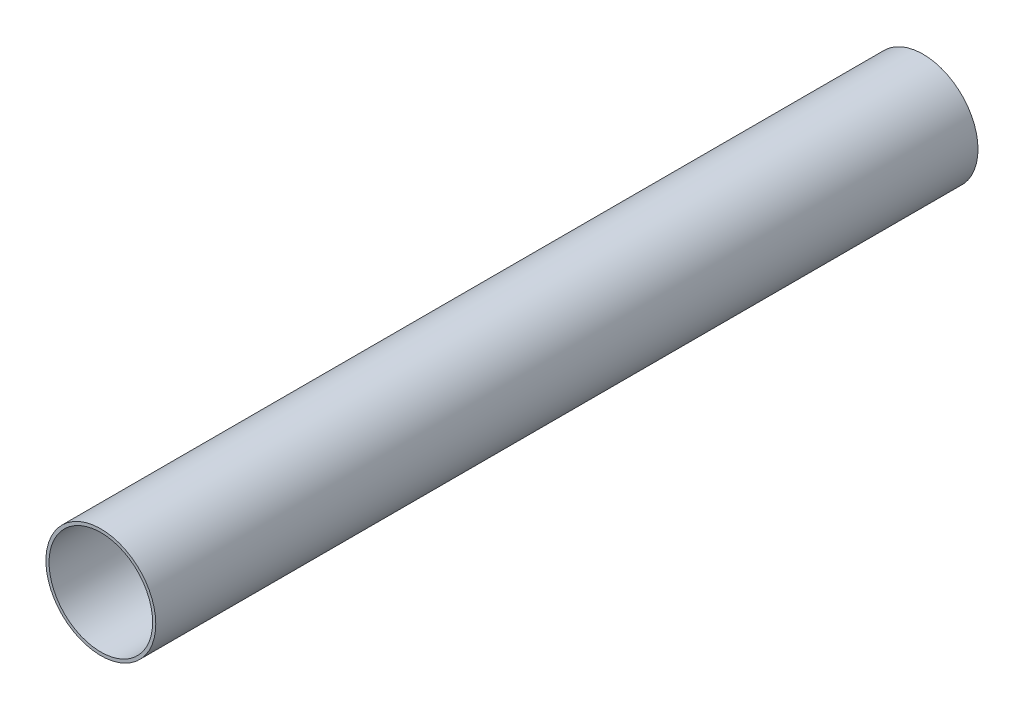
ISO-10303-21;
HEADER;
FILE_DESCRIPTION(('STEP AP214'),'2;1');
FILE_NAME('part.step','',(''),(''),'','','');
FILE_SCHEMA(('AUTOMOTIVE_DESIGN { 1 0 10303 214 1 1 1 1 }'));
ENDSEC;
DATA;
#1=APPLICATION_CONTEXT('core data for automotive mechanical design processes');
#2=APPLICATION_PROTOCOL_DEFINITION('international standard','automotive_design',2000,#1);
#3=PRODUCT_CONTEXT('',#1,'mechanical');
#4=PRODUCT('Part','Part','',(#3));
#5=PRODUCT_RELATED_PRODUCT_CATEGORY('part','',(#4));
#6=PRODUCT_DEFINITION_FORMATION('','',#4);
#7=PRODUCT_DEFINITION_CONTEXT('part definition',#1,'design');
#8=PRODUCT_DEFINITION('design','',#6,#7);
#9=PRODUCT_DEFINITION_SHAPE('','',#8);
#10=(LENGTH_UNIT() NAMED_UNIT(*) SI_UNIT(.MILLI.,.METRE.));
#11=(NAMED_UNIT(*) PLANE_ANGLE_UNIT() SI_UNIT($,.RADIAN.));
#12=(NAMED_UNIT(*) SI_UNIT($,.STERADIAN.) SOLID_ANGLE_UNIT());
#13=UNCERTAINTY_MEASURE_WITH_UNIT(LENGTH_MEASURE(1.E-05),#10,'distance_accuracy_value','');
#14=(GEOMETRIC_REPRESENTATION_CONTEXT(3) GLOBAL_UNCERTAINTY_ASSIGNED_CONTEXT((#13)) GLOBAL_UNIT_ASSIGNED_CONTEXT((#10,
#11,#12)) REPRESENTATION_CONTEXT('',''));
#15=CARTESIAN_POINT('',(0.,0.,0.));
#16=DIRECTION('',(0.,0.,1.));
#17=DIRECTION('',(1.,0.,0.));
#18=AXIS2_PLACEMENT_3D('',#15,#16,#17);
#19=CARTESIAN_POINT('',(0.,0.,660.4));
#20=DIRECTION('',(0.,0.,1.));
#21=DIRECTION('',(1.,0.,0.));
#22=AXIS2_PLACEMENT_3D('',#19,#20,#21);
#23=PLANE('',#22);
#24=CARTESIAN_POINT('',(0.,0.,660.4));
#25=DIRECTION('',(0.,0.,1.));
#26=DIRECTION('',(1.,0.,0.));
#27=AXIS2_PLACEMENT_3D('',#24,#25,#26);
#28=CIRCLE('',#27,44.1325);
#29=CARTESIAN_POINT('',(44.1325000000001,0.,660.4));
#30=VERTEX_POINT('',#29);
#31=EDGE_CURVE('E10',#30,#30,#28,.T.);
#32=ORIENTED_EDGE('',*,*,#31,.T.);
#33=EDGE_LOOP('',(#32));
#34=FACE_BOUND('',#33,.T.);
#35=CARTESIAN_POINT('',(0.,0.,660.4));
#36=DIRECTION('',(0.,0.,1.));
#37=DIRECTION('',(1.,0.,0.));
#38=AXIS2_PLACEMENT_3D('',#35,#36,#37);
#39=CIRCLE('',#38,41.5925);
#40=CARTESIAN_POINT('',(41.5925000000001,0.,660.4));
#41=VERTEX_POINT('',#40);
#42=EDGE_CURVE('E41',#41,#41,#39,.T.);
#43=ORIENTED_EDGE('',*,*,#42,.F.);
#44=EDGE_LOOP('',(#43));
#45=FACE_BOUND('',#44,.T.);
#46=ADVANCED_FACE('F30',(#34,#45),#23,.T.);
#47=CARTESIAN_POINT('',(0.,0.,0.));
#48=DIRECTION('',(0.,0.,1.));
#49=DIRECTION('',(1.,0.,0.));
#50=AXIS2_PLACEMENT_3D('',#47,#48,#49);
#51=PLANE('',#50);
#52=CARTESIAN_POINT('',(0.,0.,0.));
#53=DIRECTION('',(0.,0.,1.));
#54=DIRECTION('',(1.,0.,0.));
#55=AXIS2_PLACEMENT_3D('',#52,#53,#54);
#56=CIRCLE('',#55,44.1325);
#57=CARTESIAN_POINT('',(44.1325000000001,0.,0.));
#58=VERTEX_POINT('',#57);
#59=EDGE_CURVE('E34',#58,#58,#56,.T.);
#60=ORIENTED_EDGE('',*,*,#59,.F.);
#61=EDGE_LOOP('',(#60));
#62=FACE_BOUND('',#61,.T.);
#63=CARTESIAN_POINT('',(0.,0.,0.));
#64=DIRECTION('',(0.,0.,1.));
#65=DIRECTION('',(1.,0.,0.));
#66=AXIS2_PLACEMENT_3D('',#63,#64,#65);
#67=CIRCLE('',#66,41.5925);
#68=CARTESIAN_POINT('',(41.5925000000001,0.,0.));
#69=VERTEX_POINT('',#68);
#70=EDGE_CURVE('E43',#69,#69,#67,.T.);
#71=ORIENTED_EDGE('',*,*,#70,.T.);
#72=EDGE_LOOP('',(#71));
#73=FACE_BOUND('',#72,.T.);
#74=ADVANCED_FACE('F53',(#62,#73),#51,.F.);
#75=CARTESIAN_POINT('',(0.,0.,660.4));
#76=DIRECTION('',(0.,0.,-1.));
#77=DIRECTION('',(-1.,0.,0.));
#78=AXIS2_PLACEMENT_3D('',#75,#76,#77);
#79=CYLINDRICAL_SURFACE('',#78,44.1325);
#80=ORIENTED_EDGE('',*,*,#31,.F.);
#81=EDGE_LOOP('',(#80));
#82=FACE_BOUND('',#81,.T.);
#83=ORIENTED_EDGE('',*,*,#59,.T.);
#84=EDGE_LOOP('',(#83));
#85=FACE_BOUND('',#84,.T.);
#86=ADVANCED_FACE('F32',(#82,#85),#79,.T.);
#87=CARTESIAN_POINT('',(0.,0.,660.4));
#88=DIRECTION('',(0.,0.,-1.));
#89=DIRECTION('',(-1.,0.,0.));
#90=AXIS2_PLACEMENT_3D('',#87,#88,#89);
#91=CYLINDRICAL_SURFACE('',#90,41.5925);
#92=ORIENTED_EDGE('',*,*,#42,.T.);
#93=EDGE_LOOP('',(#92));
#94=FACE_BOUND('',#93,.T.);
#95=ORIENTED_EDGE('',*,*,#70,.F.);
#96=EDGE_LOOP('',(#95));
#97=FACE_BOUND('',#96,.T.);
#98=ADVANCED_FACE('F49',(#94,#97),#91,.F.);
#99=CLOSED_SHELL('',(#46,#74,#86,#98));
#100=MANIFOLD_SOLID_BREP('B2',#99);
#101=ADVANCED_BREP_SHAPE_REPRESENTATION('',(#18,#100),#14);
#102=SHAPE_DEFINITION_REPRESENTATION(#9,#101);
ENDSEC;
END-ISO-10303-21;
